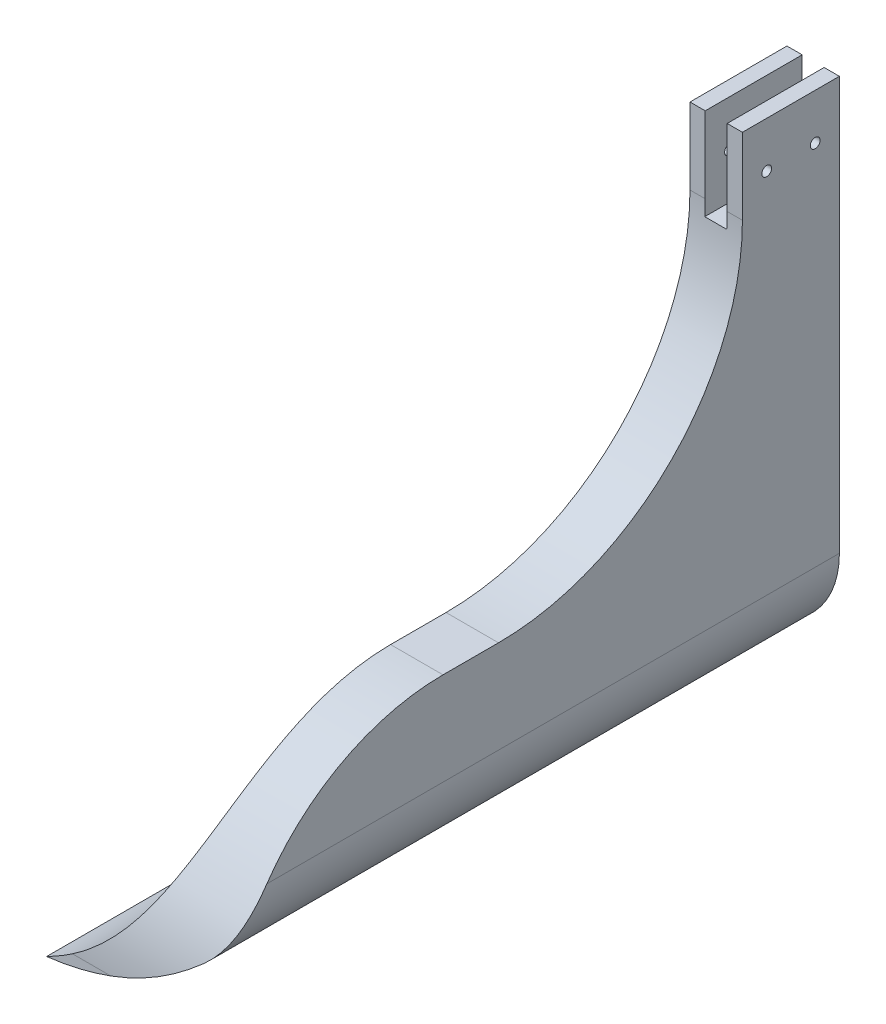
ISO-10303-21;
HEADER;
FILE_DESCRIPTION(('STEP AP214'),'2;1');
FILE_NAME('part.step','',(''),(''),'','','');
FILE_SCHEMA(('AUTOMOTIVE_DESIGN { 1 0 10303 214 1 1 1 1 }'));
ENDSEC;
DATA;
#1=APPLICATION_CONTEXT('core data for automotive mechanical design processes');
#2=APPLICATION_PROTOCOL_DEFINITION('international standard','automotive_design',2000,#1);
#3=PRODUCT_CONTEXT('',#1,'mechanical');
#4=PRODUCT('Part','Part','',(#3));
#5=PRODUCT_RELATED_PRODUCT_CATEGORY('part','',(#4));
#6=PRODUCT_DEFINITION_FORMATION('','',#4);
#7=PRODUCT_DEFINITION_CONTEXT('part definition',#1,'design');
#8=PRODUCT_DEFINITION('design','',#6,#7);
#9=PRODUCT_DEFINITION_SHAPE('','',#8);
#10=(LENGTH_UNIT() NAMED_UNIT(*) SI_UNIT(.MILLI.,.METRE.));
#11=(NAMED_UNIT(*) PLANE_ANGLE_UNIT() SI_UNIT($,.RADIAN.));
#12=(NAMED_UNIT(*) SI_UNIT($,.STERADIAN.) SOLID_ANGLE_UNIT());
#13=UNCERTAINTY_MEASURE_WITH_UNIT(LENGTH_MEASURE(1.E-05),#10,'distance_accuracy_value','');
#14=(GEOMETRIC_REPRESENTATION_CONTEXT(3) GLOBAL_UNCERTAINTY_ASSIGNED_CONTEXT((#13)) GLOBAL_UNIT_ASSIGNED_CONTEXT((#10,
#11,#12)) REPRESENTATION_CONTEXT('',''));
#15=CARTESIAN_POINT('',(0.,0.,0.));
#16=DIRECTION('',(0.,0.,1.));
#17=DIRECTION('',(1.,0.,0.));
#18=AXIS2_PLACEMENT_3D('',#15,#16,#17);
#19=CARTESIAN_POINT('',(0.,0.,31.8));
#20=DIRECTION('',(0.,0.,1.));
#21=DIRECTION('',(-1.,0.,0.));
#22=AXIS2_PLACEMENT_3D('',#19,#20,#21);
#23=PLANE('',#22);
#24=DIRECTION('',(0.,1.,0.));
#25=VECTOR('',#24,1.);
#26=CARTESIAN_POINT('',(30.,0.,31.8));
#27=LINE('',#26,#25);
#28=CARTESIAN_POINT('',(30.,80.,31.8));
#29=VERTEX_POINT('',#28);
#30=CARTESIAN_POINT('',(30.,105.,31.8));
#31=VERTEX_POINT('',#30);
#32=EDGE_CURVE('E238',#29,#31,#27,.T.);
#33=ORIENTED_EDGE('',*,*,#32,.T.);
#34=DIRECTION('',(-1.,0.,0.));
#35=VECTOR('',#34,1.);
#36=CARTESIAN_POINT('',(0.,105.,31.8));
#37=LINE('',#36,#35);
#38=CARTESIAN_POINT('',(25.,105.,31.8));
#39=VERTEX_POINT('',#38);
#40=EDGE_CURVE('E254',#31,#39,#37,.T.);
#41=ORIENTED_EDGE('',*,*,#40,.T.);
#42=DIRECTION('',(0.,-1.,0.));
#43=VECTOR('',#42,1.);
#44=CARTESIAN_POINT('',(25.,0.,31.8));
#45=LINE('',#44,#43);
#46=CARTESIAN_POINT('',(25.,80.,31.8));
#47=VERTEX_POINT('',#46);
#48=EDGE_CURVE('E251',#39,#47,#45,.T.);
#49=ORIENTED_EDGE('',*,*,#48,.T.);
#50=DIRECTION('',(-1.,0.,0.));
#51=VECTOR('',#50,1.);
#52=CARTESIAN_POINT('',(12.8,80.,31.8));
#53=LINE('',#52,#51);
#54=EDGE_CURVE('E303',#29,#47,#53,.T.);
#55=ORIENTED_EDGE('',*,*,#54,.F.);
#56=EDGE_LOOP('',(#33,#41,#49,#55));
#57=FACE_BOUND('',#56,.T.);
#58=ADVANCED_FACE('F45',(#57),#23,.T.);
#59=DIRECTION('',(0.,-1.,0.));
#60=VECTOR('',#59,1.);
#61=CARTESIAN_POINT('',(17.8,0.,31.8));
#62=LINE('',#61,#60);
#63=CARTESIAN_POINT('',(17.8,105.,31.8));
#64=VERTEX_POINT('',#63);
#65=CARTESIAN_POINT('',(17.8,80.,31.8));
#66=VERTEX_POINT('',#65);
#67=EDGE_CURVE('E248',#64,#66,#62,.T.);
#68=ORIENTED_EDGE('',*,*,#67,.F.);
#69=DIRECTION('',(-1.,0.,0.));
#70=VECTOR('',#69,1.);
#71=CARTESIAN_POINT('',(0.,105.,31.8));
#72=LINE('',#71,#70);
#73=CARTESIAN_POINT('',(12.8,105.,31.8));
#74=VERTEX_POINT('',#73);
#75=EDGE_CURVE('E245',#64,#74,#72,.T.);
#76=ORIENTED_EDGE('',*,*,#75,.T.);
#77=DIRECTION('',(0.,-1.,0.));
#78=VECTOR('',#77,1.);
#79=CARTESIAN_POINT('',(12.8,0.,31.8));
#80=LINE('',#79,#78);
#81=CARTESIAN_POINT('',(12.8,80.,31.8));
#82=VERTEX_POINT('',#81);
#83=EDGE_CURVE('E241',#74,#82,#80,.T.);
#84=ORIENTED_EDGE('',*,*,#83,.T.);
#85=DIRECTION('',(-1.,0.,0.));
#86=VECTOR('',#85,1.);
#87=CARTESIAN_POINT('',(12.8,80.,31.8));
#88=LINE('',#87,#86);
#89=EDGE_CURVE('E300',#66,#82,#88,.T.);
#90=ORIENTED_EDGE('',*,*,#89,.F.);
#91=EDGE_LOOP('',(#68,#76,#84,#90));
#92=FACE_BOUND('',#91,.T.);
#93=ADVANCED_FACE('F384',(#92),#23,.T.);
#94=CARTESIAN_POINT('',(30.,0.,31.8));
#95=DIRECTION('',(1.,0.,0.));
#96=DIRECTION('',(0.,-1.,0.));
#97=AXIS2_PLACEMENT_3D('',#94,#95,#96);
#98=PLANE('',#97);
#99=CARTESIAN_POINT('',(30.,90.,7.95));
#100=DIRECTION('',(1.,0.,0.));
#101=DIRECTION('',(0.,0.,1.));
#102=AXIS2_PLACEMENT_3D('',#99,#100,#101);
#103=CIRCLE('',#102,1.6);
#104=CARTESIAN_POINT('',(30.,90.,9.55));
#105=VERTEX_POINT('',#104);
#106=EDGE_CURVE('E202',#105,#105,#103,.T.);
#107=ORIENTED_EDGE('',*,*,#106,.F.);
#108=EDGE_LOOP('',(#107));
#109=FACE_BOUND('',#108,.T.);
#110=CARTESIAN_POINT('',(30.,90.,23.85));
#111=DIRECTION('',(1.,0.,0.));
#112=DIRECTION('',(0.,0.,-1.));
#113=AXIS2_PLACEMENT_3D('',#110,#111,#112);
#114=CIRCLE('',#113,1.6);
#115=CARTESIAN_POINT('',(30.,90.,22.25));
#116=VERTEX_POINT('',#115);
#117=EDGE_CURVE('E190',#116,#116,#114,.T.);
#118=ORIENTED_EDGE('',*,*,#117,.F.);
#119=EDGE_LOOP('',(#118));
#120=FACE_BOUND('',#119,.T.);
#121=DIRECTION('',(0.,0.,1.));
#122=VECTOR('',#121,1.);
#123=CARTESIAN_POINT('',(30.,-30.4818047918599,200.));
#124=LINE('',#123,#122);
#125=CARTESIAN_POINT('',(30.,-30.4818047918599,0.));
#126=VERTEX_POINT('',#125);
#127=CARTESIAN_POINT('',(30.,-30.4818047918599,187.778129491109));
#128=VERTEX_POINT('',#127);
#129=EDGE_CURVE('E324',#126,#128,#124,.T.);
#130=ORIENTED_EDGE('',*,*,#129,.F.);
#131=DIRECTION('',(0.,1.,0.));
#132=VECTOR('',#131,1.);
#133=CARTESIAN_POINT('',(30.,0.,0.));
#134=LINE('',#133,#132);
#135=CARTESIAN_POINT('',(30.,105.,0.));
#136=VERTEX_POINT('',#135);
#137=EDGE_CURVE('E235',#126,#136,#134,.T.);
#138=ORIENTED_EDGE('',*,*,#137,.T.);
#139=DIRECTION('',(0.,0.,-1.));
#140=VECTOR('',#139,1.);
#141=CARTESIAN_POINT('',(30.,105.,31.8));
#142=LINE('',#141,#140);
#143=EDGE_CURVE('E257',#31,#136,#142,.T.);
#144=ORIENTED_EDGE('',*,*,#143,.F.);
#145=ORIENTED_EDGE('',*,*,#32,.F.);
#146=CARTESIAN_POINT('',(30.,80.,111.8));
#147=DIRECTION('',(-1.,0.,0.));
#148=DIRECTION('',(0.,-1.,0.));
#149=AXIS2_PLACEMENT_3D('',#146,#147,#148);
#150=CIRCLE('',#149,80.);
#151=CARTESIAN_POINT('',(30.,0.,111.8));
#152=VERTEX_POINT('',#151);
#153=EDGE_CURVE('E317',#152,#29,#150,.F.);
#154=ORIENTED_EDGE('',*,*,#153,.F.);
#155=DIRECTION('',(0.,0.,-1.));
#156=VECTOR('',#155,1.);
#157=CARTESIAN_POINT('',(30.,0.,200.));
#158=LINE('',#157,#156);
#159=CARTESIAN_POINT('',(30.,0.,130.));
#160=VERTEX_POINT('',#159);
#161=EDGE_CURVE('E231',#160,#152,#158,.T.);
#162=ORIENTED_EDGE('',*,*,#161,.F.);
#163=CARTESIAN_POINT('',(30.0000000000001,-70.,130.));
#164=DIRECTION('',(-1.,0.,0.));
#165=DIRECTION('',(0.,-1.,0.));
#166=AXIS2_PLACEMENT_3D('',#163,#164,#165);
#167=CIRCLE('',#166,70.);
#168=EDGE_CURVE('E367',#128,#160,#167,.T.);
#169=ORIENTED_EDGE('',*,*,#168,.F.);
#170=EDGE_LOOP('',(#130,#138,#144,#145,#154,#162,#169));
#171=FACE_BOUND('',#170,.T.);
#172=ADVANCED_FACE('F351',(#109,#120,#171),#98,.T.);
#173=CARTESIAN_POINT('',(-40.5018522884248,16.2007409153699,31.8));
#174=DIRECTION('',(0.,0.,-1.));
#175=DIRECTION('',(1.,0.,0.));
#176=AXIS2_PLACEMENT_3D('',#173,#174,#175);
#177=CYLINDRICAL_SURFACE('',#176,91.803398874989);
#178=DIRECTION('',(0.,0.,-1.));
#179=VECTOR('',#178,1.);
#180=CARTESIAN_POINT('',(0.,-66.1853259054642,31.8));
#181=LINE('',#180,#179);
#182=CARTESIAN_POINT('',(0.,-66.1853259054642,160.893258265666));
#183=VERTEX_POINT('',#182);
#184=CARTESIAN_POINT('',(0.,-66.1853259054642,179.909808110345));
#185=VERTEX_POINT('',#184);
#186=EDGE_CURVE('E193',#183,#185,#181,.F.);
#187=ORIENTED_EDGE('',*,*,#186,.T.);
#188=CARTESIAN_POINT('',(-40.5018522884248,16.2007409153699,15.1376744686769));
#189=DIRECTION('',(0.,-0.894427190999916,-0.447213595499958));
#190=DIRECTION('',(0.,0.447213595499958,-0.894427190999916));
#191=AXIS2_PLACEMENT_3D('',#188,#189,#190);
#192=ELLIPSE('',#191,205.278640450003,91.803398874989);
#193=CARTESIAN_POINT('',(15.325484142754,-56.6770509831248,160.893258265666));
#194=VERTEX_POINT('',#193);
#195=EDGE_CURVE('E54',#194,#185,#192,.T.);
#196=ORIENTED_EDGE('',*,*,#195,.F.);
#197=CARTESIAN_POINT('',(-40.5018522884248,16.2007409153699,160.893258265666));
#198=DIRECTION('',(0.,0.,1.));
#199=DIRECTION('',(1.,0.,0.));
#200=AXIS2_PLACEMENT_3D('',#197,#198,#199);
#201=CIRCLE('',#200,91.803398874989);
#202=EDGE_CURVE('E11',#183,#194,#201,.T.);
#203=ORIENTED_EDGE('',*,*,#202,.F.);
#204=EDGE_LOOP('',(#187,#196,#203));
#205=FACE_BOUND('',#204,.T.);
#206=CARTESIAN_POINT('',(-40.5018522884248,16.2007409153699,21.8458784011762));
#207=DIRECTION('',(0.,0.894427190999916,0.447213595499958));
#208=DIRECTION('',(0.,0.447213595499958,-0.894427190999916));
#209=AXIS2_PLACEMENT_3D('',#206,#207,#208);
#210=ELLIPSE('',#209,205.278640450003,91.803398874989);
#211=CARTESIAN_POINT('',(0.,-66.1853259054642,186.618012042844));
#212=VERTEX_POINT('',#211);
#213=CARTESIAN_POINT('',(17.4491488944943,-55.,164.247360231916));
#214=VERTEX_POINT('',#213);
#215=EDGE_CURVE('E697',#212,#214,#210,.T.);
#216=ORIENTED_EDGE('',*,*,#215,.F.);
#217=DIRECTION('',(0.,0.,-1.));
#218=VECTOR('',#217,1.);
#219=CARTESIAN_POINT('',(0.,-66.1853259054642,31.8));
#220=LINE('',#219,#218);
#221=CARTESIAN_POINT('',(0.,-66.1853259054642,190.893258265666));
#222=VERTEX_POINT('',#221);
#223=EDGE_CURVE('E689',#222,#212,#220,.T.);
#224=ORIENTED_EDGE('',*,*,#223,.F.);
#225=CARTESIAN_POINT('',(-40.5018522884248,16.2007409153699,190.893258265666));
#226=DIRECTION('',(0.,0.,-1.));
#227=DIRECTION('',(-1.,0.,0.));
#228=AXIS2_PLACEMENT_3D('',#225,#226,#227);
#229=CIRCLE('',#228,91.803398874989);
#230=CARTESIAN_POINT('',(17.4491488944943,-55.,190.893258265666));
#231=VERTEX_POINT('',#230);
#232=EDGE_CURVE('E693',#231,#222,#229,.T.);
#233=ORIENTED_EDGE('',*,*,#232,.F.);
#234=DIRECTION('',(0.,0.,-1.));
#235=VECTOR('',#234,1.);
#236=CARTESIAN_POINT('',(17.4491488944943,-55.,31.8));
#237=LINE('',#236,#235);
#238=EDGE_CURVE('E703',#214,#231,#237,.F.);
#239=ORIENTED_EDGE('',*,*,#238,.F.);
#240=EDGE_LOOP('',(#216,#224,#233,#239));
#241=FACE_BOUND('',#240,.T.);
#242=CARTESIAN_POINT('',(-40.5018522884248,16.2007409153699,200.));
#243=DIRECTION('',(0.,0.,-1.));
#244=DIRECTION('',(-1.,0.,0.));
#245=AXIS2_PLACEMENT_3D('',#242,#243,#244);
#246=CIRCLE('',#245,91.803398874989);
#247=CARTESIAN_POINT('',(-8.92185370321916,-70.,200.));
#248=VERTEX_POINT('',#247);
#249=CARTESIAN_POINT('',(-30.,-75.,200.));
#250=VERTEX_POINT('',#249);
#251=EDGE_CURVE('E228',#248,#250,#246,.T.);
#252=ORIENTED_EDGE('',*,*,#251,.T.);
#253=DIRECTION('',(0.,0.,-1.));
#254=VECTOR('',#253,1.);
#255=CARTESIAN_POINT('',(-30.,-75.,31.8));
#256=LINE('',#255,#254);
#257=CARTESIAN_POINT('',(-30.,-75.,0.));
#258=VERTEX_POINT('',#257);
#259=EDGE_CURVE('E297',#250,#258,#256,.T.);
#260=ORIENTED_EDGE('',*,*,#259,.T.);
#261=CARTESIAN_POINT('',(-40.5018522884248,16.2007409153699,0.));
#262=DIRECTION('',(0.,0.,-1.));
#263=DIRECTION('',(-1.,0.,0.));
#264=AXIS2_PLACEMENT_3D('',#261,#262,#263);
#265=CIRCLE('',#264,91.803398874989);
#266=CARTESIAN_POINT('',(19.660012083,-53.1419884825606,0.));
#267=VERTEX_POINT('',#266);
#268=EDGE_CURVE('E260',#267,#258,#265,.T.);
#269=ORIENTED_EDGE('',*,*,#268,.F.);
#270=DIRECTION('',(0.,0.,-1.));
#271=VECTOR('',#270,1.);
#272=CARTESIAN_POINT('',(19.660012083,-53.1419884825606,31.8));
#273=LINE('',#272,#271);
#274=CARTESIAN_POINT('',(19.660012083,-53.1419884825606,197.939733938822));
#275=VERTEX_POINT('',#274);
#276=EDGE_CURVE('E319',#275,#267,#273,.T.);
#277=ORIENTED_EDGE('',*,*,#276,.F.);
#278=CARTESIAN_POINT('',(-8.92185370321916,-70.,200.));
#279=CARTESIAN_POINT('',(-8.26411347929146,-69.7590340717941,199.999996557121));
#280=CARTESIAN_POINT('',(-7.60915491631928,-69.5105483306834,199.998756105011));
#281=CARTESIAN_POINT('',(-6.3051005385999,-68.9986541052959,199.993306250773));
#282=CARTESIAN_POINT('',(-5.65600478485099,-68.7352454659641,199.989096817792));
#283=CARTESIAN_POINT('',(-3.71796967445498,-67.9228133991998,199.971272558723));
#284=CARTESIAN_POINT('',(-2.43829432753717,-67.3515881678083,199.952461754739));
#285=CARTESIAN_POINT('',(0.0808646972158559,-66.1572063567584,199.896972592429));
#286=CARTESIAN_POINT('',(1.32061868494865,-65.5346107836442,199.860470339025));
#287=CARTESIAN_POINT('',(3.77000210090307,-64.2342601642477,199.765186323071));
#288=CARTESIAN_POINT('',(4.9796318632748,-63.556505730166,199.70640480777));
#289=CARTESIAN_POINT('',(7.36616863705288,-62.1474395501762,199.561763915276));
#290=CARTESIAN_POINT('',(8.54306534212335,-61.416111193555,199.475896112403));
#291=CARTESIAN_POINT('',(10.8605794110915,-59.9023483642921,199.272077014389));
#292=CARTESIAN_POINT('',(12.0011988308855,-59.1199167954588,199.154127541001));
#293=CARTESIAN_POINT('',(14.2540933252477,-57.4986133623688,198.87958909915));
#294=CARTESIAN_POINT('',(15.3659815239629,-56.6592638878951,198.722633109577));
#295=CARTESIAN_POINT('',(17.0011786800007,-55.3656549531663,198.454582993224));
#296=CARTESIAN_POINT('',(17.5408960161882,-54.9286090246824,198.35977765231));
#297=CARTESIAN_POINT('',(18.6090291205779,-54.0434682881892,198.158602112912));
#298=CARTESIAN_POINT('',(19.1374444600317,-53.5953730624011,198.05223147662));
#299=CARTESIAN_POINT('',(19.6600120829999,-53.1419884825606,197.939733938822));
#300=B_SPLINE_CURVE_WITH_KNOTS('',3,(#278,#279,#280,#281,#282,#283,#284,#285,#286,#287,#288,
#289,#290,#291,#292,#293,#294,#295,#296,#297,#298,#299),.UNSPECIFIED.,.F.,.F.,(4,2,2,2,2,2,2,2,
2,2,4),(0.,2.10137287499703,4.20276758812977,8.40559486633036,12.5674196708921,16.7291982902267,
20.8922727846682,25.0551109285769,29.2587084386886,31.3612368974471,33.463844975971),.UNSPECIFIED.);
#301=EDGE_CURVE('E354',#248,#275,#300,.T.);
#302=ORIENTED_EDGE('',*,*,#301,.F.);
#303=EDGE_LOOP('',(#252,#260,#269,#277,#302));
#304=FACE_BOUND('',#303,.T.);
#305=ADVANCED_FACE('F345',(#205,#241,#304),#177,.T.);
#306=CARTESIAN_POINT('',(-65.6980576649736,-4.91604175918838,31.8));
#307=DIRECTION('',(0.,0.,-1.));
#308=DIRECTION('',(1.,0.,0.));
#309=AXIS2_PLACEMENT_3D('',#306,#307,#308);
#310=CYLINDRICAL_SURFACE('',#309,78.6518437403193);
#311=DIRECTION('',(0.,0.,-1.));
#312=VECTOR('',#311,1.);
#313=CARTESIAN_POINT('',(12.8,0.,200.));
#314=LINE('',#313,#312);
#315=CARTESIAN_POINT('',(12.8,0.,130.));
#316=VERTEX_POINT('',#315);
#317=CARTESIAN_POINT('',(12.8,0.,111.8));
#318=VERTEX_POINT('',#317);
#319=EDGE_CURVE('E232',#316,#318,#314,.T.);
#320=ORIENTED_EDGE('',*,*,#319,.T.);
#321=DIRECTION('',(0.,0.,-1.));
#322=VECTOR('',#321,1.);
#323=CARTESIAN_POINT('',(12.8,0.,31.8));
#324=LINE('',#323,#322);
#325=CARTESIAN_POINT('',(12.8,0.,0.));
#326=VERTEX_POINT('',#325);
#327=EDGE_CURVE('E294',#318,#326,#324,.T.);
#328=ORIENTED_EDGE('',*,*,#327,.T.);
#329=CARTESIAN_POINT('',(-65.6980576649736,-4.91604175918838,0.));
#330=DIRECTION('',(0.,0.,-1.));
#331=DIRECTION('',(-1.,0.,0.));
#332=AXIS2_PLACEMENT_3D('',#329,#330,#331);
#333=CIRCLE('',#332,78.6518437403193);
#334=EDGE_CURVE('E263',#326,#258,#333,.T.);
#335=ORIENTED_EDGE('',*,*,#334,.T.);
#336=ORIENTED_EDGE('',*,*,#259,.F.);
#337=CARTESIAN_POINT('',(-65.6980576649736,-4.91604175918838,200.));
#338=DIRECTION('',(0.,0.,-1.));
#339=DIRECTION('',(-1.,0.,0.));
#340=AXIS2_PLACEMENT_3D('',#337,#338,#339);
#341=CIRCLE('',#340,78.6518437403193);
#342=CARTESIAN_POINT('',(-21.5370918302017,-70.,200.));
#343=VERTEX_POINT('',#342);
#344=EDGE_CURVE('E226',#343,#250,#341,.T.);
#345=ORIENTED_EDGE('',*,*,#344,.F.);
#346=CARTESIAN_POINT('',(12.8,0.,130.));
#347=CARTESIAN_POINT('',(12.7999642052155,1.32345455669019E-05,130.98094729135));
#348=CARTESIAN_POINT('',(12.8012901008779,-0.0206193070886854,131.961892960559));
#349=CARTESIAN_POINT('',(12.8064078399143,-0.10308054150943,133.922039054772));
#350=CARTESIAN_POINT('',(12.8101996682476,-0.164908983029099,134.901239490383));
#351=CARTESIAN_POINT('',(12.8199915316035,-0.329661340319642,136.856102501738));
#352=CARTESIAN_POINT('',(12.8259914251348,-0.432582622927384,137.831765300127));
#353=CARTESIAN_POINT('',(12.8396924430125,-0.679333026045934,139.777891860139));
#354=CARTESIAN_POINT('',(12.8473935675724,-0.823162151692727,140.74835562111));
#355=CARTESIAN_POINT('',(12.8638184684743,-1.15158193864885,142.683006513837));
#356=CARTESIAN_POINT('',(12.8725429113507,-1.33619923711572,143.647189118037));
#357=CARTESIAN_POINT('',(12.8901362015666,-1.74581581673852,145.566940995437));
#358=CARTESIAN_POINT('',(12.8990050495374,-1.97081527447156,146.522510230956));
#359=CARTESIAN_POINT('',(12.9158367242898,-2.46079960482181,148.423347259794));
#360=CARTESIAN_POINT('',(12.9237995534837,-2.72578437097588,149.368615080534));
#361=CARTESIAN_POINT('',(12.9376006330794,-3.29527453695544,151.247186571631));
#362=CARTESIAN_POINT('',(12.9434388834784,-3.59977993683442,152.18049024197));
#363=CARTESIAN_POINT('',(12.9516171100602,-4.24798538026195,154.034083960523));
#364=CARTESIAN_POINT('',(12.9539548115935,-4.59171075291293,154.954365162439));
#365=CARTESIAN_POINT('',(12.953598374494,-5.31761526962595,156.779729437704));
#366=CARTESIAN_POINT('',(12.9509037973953,-5.69979776173786,157.684811179779));
#367=CARTESIAN_POINT('',(12.9388198943983,-6.50187184626557,159.477997962379));
#368=CARTESIAN_POINT('',(12.9294309972237,-6.92176102233105,160.366104086332));
#369=CARTESIAN_POINT('',(12.9021725554772,-7.79852359327602,162.123838410132));
#370=CARTESIAN_POINT('',(12.884302272619,-8.25540020495931,162.993464994487));
#371=CARTESIAN_POINT('',(12.8381948363613,-9.20503309027219,164.712181682612));
#372=CARTESIAN_POINT('',(12.8099617614731,-9.69777518714552,165.561279725911));
#373=CARTESIAN_POINT('',(12.7411414527228,-10.7182908646927,167.237640193839));
#374=CARTESIAN_POINT('',(12.7005543474723,-11.2460640806306,168.064902845689));
#375=CARTESIAN_POINT('',(12.6049609531509,-12.3355304447598,169.695979780155));
#376=CARTESIAN_POINT('',(12.5499541463491,-12.8972248103128,170.499793219688));
#377=CARTESIAN_POINT('',(12.4234087432706,-14.0531640085298,172.082198835525));
#378=CARTESIAN_POINT('',(12.3518720097676,-14.6474051677109,172.860793842453));
#379=CARTESIAN_POINT('',(12.1920437722545,-15.8524554175663,174.372915322861));
#380=CARTESIAN_POINT('',(12.1041934550096,-16.4625293539679,175.107074148351));
#381=CARTESIAN_POINT('',(11.9086905829031,-17.710733480593,176.548267763277));
#382=CARTESIAN_POINT('',(11.8010404654614,-18.348860210076,177.255305878427));
#383=CARTESIAN_POINT('',(11.5639356571324,-19.6515506920616,178.64090793562));
#384=CARTESIAN_POINT('',(11.4344793993949,-20.3161163416736,179.319469827164));
#385=CARTESIAN_POINT('',(11.1518321938311,-21.6696962583781,180.646619764897));
#386=CARTESIAN_POINT('',(10.9986412898397,-22.3587104803153,181.295207866442));
#387=CARTESIAN_POINT('',(10.6668499143928,-23.7582831361081,182.560370286155));
#388=CARTESIAN_POINT('',(10.4882765034753,-24.4688179997998,183.176977755734));
#389=CARTESIAN_POINT('',(10.1038723756982,-25.9097528843875,184.377656933986));
#390=CARTESIAN_POINT('',(9.89804147436741,-26.6401530396997,184.961728422429));
#391=CARTESIAN_POINT('',(9.45758268403362,-28.1181270265323,186.096135696885));
#392=CARTESIAN_POINT('',(9.22295823794597,-28.8656987961282,186.646475504503));
#393=CARTESIAN_POINT('',(8.72351918589893,-30.3752916580421,187.712531037096));
#394=CARTESIAN_POINT('',(8.4587055543141,-31.137312283353,188.228247878695));
#395=CARTESIAN_POINT('',(7.93001931109923,-32.584472773664,189.167003233628));
#396=CARTESIAN_POINT('',(7.669544319307,-33.268370169632,189.593877807661));
#397=CARTESIAN_POINT('',(7.12341517144908,-34.6430082659281,190.41958244135));
#398=CARTESIAN_POINT('',(6.83776131712554,-35.3337488841593,190.818412836983));
#399=CARTESIAN_POINT('',(6.24082257612842,-36.7198050399644,191.587798058142));
#400=CARTESIAN_POINT('',(5.92953968663455,-37.4151202171811,191.958355082584));
#401=CARTESIAN_POINT('',(5.28101495200494,-38.8081357225157,192.671203678839));
#402=CARTESIAN_POINT('',(4.94377295444956,-39.5058360646151,193.013495084667));
#403=CARTESIAN_POINT('',(4.24327025766634,-40.9012120614288,193.669890120222));
#404=CARTESIAN_POINT('',(3.88001513011249,-41.5988876895975,193.98399975384));
#405=CARTESIAN_POINT('',(3.12745058026877,-42.9921340918443,194.584445569177));
#406=CARTESIAN_POINT('',(2.73814107478683,-43.6877048591942,194.870781662207));
#407=CARTESIAN_POINT('',(1.93366641804871,-45.0745406619204,195.416180525879));
#408=CARTESIAN_POINT('',(1.51850190119297,-45.7658058024858,195.675243965286));
#409=CARTESIAN_POINT('',(0.662642720439212,-47.141940330372,196.166781298714));
#410=CARTESIAN_POINT('',(0.221948330836136,-47.8268097863169,196.399255478333));
#411=CARTESIAN_POINT('',(-0.656477467979024,-49.1460540171751,196.824869596594));
#412=CARTESIAN_POINT('',(-1.09270702314447,-49.7809324562113,197.01955289668));
#413=CARTESIAN_POINT('',(-1.9867943613766,-51.0417916830196,197.38707289288));
#414=CARTESIAN_POINT('',(-2.44465384188241,-51.6677717674492,197.55990787049));
#415=CARTESIAN_POINT('',(-3.38139036084645,-52.9092711531631,197.884597783291));
#416=CARTESIAN_POINT('',(-3.86026549470647,-53.5247913954127,198.036454614529));
#417=CARTESIAN_POINT('',(-4.8384733175493,-54.7440936289768,198.320196643952));
#418=CARTESIAN_POINT('',(-5.33780769178084,-55.3478746472546,198.452080192699));
#419=CARTESIAN_POINT('',(-6.86598372777234,-57.1402132667528,198.819425881448));
#420=CARTESIAN_POINT('',(-7.92470865160013,-58.3093819594017,199.026484181363));
#421=CARTESIAN_POINT('',(-10.1156727859152,-60.5865713259255,199.373729735374));
#422=CARTESIAN_POINT('',(-11.2479006604402,-61.6946013803495,199.51392727334));
#423=CARTESIAN_POINT('',(-13.1281865319347,-63.4264237151067,199.693798922025));
#424=CARTESIAN_POINT('',(-13.855125488556,-64.0715004017586,199.751374756066));
#425=CARTESIAN_POINT('',(-15.3330564455398,-65.334779522204,199.847239474091));
#426=CARTESIAN_POINT('',(-16.0840445250149,-65.952986298424,199.885531485188));
#427=CARTESIAN_POINT('',(-17.6063569047051,-67.159442679523,199.944942190882));
#428=CARTESIAN_POINT('',(-18.377607137825,-67.7477831586652,199.966116322529));
#429=CARTESIAN_POINT('',(-19.9415770152844,-68.8957153735764,199.993641814773));
#430=CARTESIAN_POINT('',(-20.7342984535689,-69.4553046957657,199.999991932918));
#431=CARTESIAN_POINT('',(-21.5370918302017,-70.,200.));
#432=B_SPLINE_CURVE_WITH_KNOTS('',3,(#346,#347,#348,#349,#350,#351,#352,#353,#354,#355,#356,
#357,#358,#359,#360,#361,#362,#363,#364,#365,#366,#367,#368,#369,#370,#371,#372,#373,#374,#375,
#376,#377,#378,#379,#380,#381,#382,#383,#384,#385,#386,#387,#388,#389,#390,#391,#392,#393,#394,
#395,#396,#397,#398,#399,#400,#401,#402,#403,#404,#405,#406,#407,#408,#409,#410,#411,#412,#413,
#414,#415,#416,#417,#418,#419,#420,#421,#422,#423,#424,#425,#426,#427,#428,#429,#430,#431),
.UNSPECIFIED.,.F.,.F.,(4,2,2,2,2,2,2,2,2,2,2,2,2,2,2,2,2,2,2,2,2,2,2,2,2,2,2,2,2,2,2,2,2,2,2,2,
2,2,2,2,2,2,4),(0.,2.94262158965359,5.88522523149164,8.82764034627742,11.7700558304839,
14.7143986010373,17.6587542464902,20.6031020525685,23.5474498626326,26.4937100749431,
29.4402270088876,32.3865552563032,35.3331400222494,38.2785663343969,41.2239619842527,
44.1694634013128,47.1146330486765,49.9894298934195,52.8638730778792,55.7385228896609,
58.6131673923732,61.4847698800872,64.3563918029919,67.2276706929036,70.0988569367424,
72.6396807618396,75.1804741419777,77.7210697141669,80.2616802046734,82.8017481477324,
85.3418242016574,87.881837954664,90.4218244226245,92.8047485940591,95.1878600805122,
97.5707560355112,99.9538486682678,104.721504243682,109.488426268181,112.408419445765,
115.327938957314,118.23796516056,121.148235254614),.UNSPECIFIED.);
#433=EDGE_CURVE('E329',#316,#343,#432,.T.);
#434=ORIENTED_EDGE('',*,*,#433,.F.);
#435=EDGE_LOOP('',(#320,#328,#335,#336,#345,#434));
#436=FACE_BOUND('',#435,.T.);
#437=ADVANCED_FACE('F339',(#436),#310,.F.);
#438=CARTESIAN_POINT('',(12.8,0.,31.8));
#439=DIRECTION('',(-1.,0.,0.));
#440=DIRECTION('',(0.,1.,0.));
#441=AXIS2_PLACEMENT_3D('',#438,#439,#440);
#442=PLANE('',#441);
#443=CARTESIAN_POINT('',(12.8,90.,7.95));
#444=DIRECTION('',(1.,0.,0.));
#445=DIRECTION('',(0.,1.,0.));
#446=AXIS2_PLACEMENT_3D('',#443,#444,#445);
#447=CIRCLE('',#446,1.6);
#448=CARTESIAN_POINT('',(12.8,91.6,7.95));
#449=VERTEX_POINT('',#448);
#450=EDGE_CURVE('E223',#449,#449,#447,.T.);
#451=ORIENTED_EDGE('',*,*,#450,.T.);
#452=EDGE_LOOP('',(#451));
#453=FACE_BOUND('',#452,.T.);
#454=CARTESIAN_POINT('',(12.8,90.,23.85));
#455=DIRECTION('',(1.,0.,0.));
#456=DIRECTION('',(0.,1.,0.));
#457=AXIS2_PLACEMENT_3D('',#454,#455,#456);
#458=CIRCLE('',#457,1.6);
#459=CARTESIAN_POINT('',(12.8,91.6,23.85));
#460=VERTEX_POINT('',#459);
#461=EDGE_CURVE('E216',#460,#460,#458,.T.);
#462=ORIENTED_EDGE('',*,*,#461,.T.);
#463=EDGE_LOOP('',(#462));
#464=FACE_BOUND('',#463,.T.);
#465=DIRECTION('',(0.,-1.,0.));
#466=VECTOR('',#465,1.);
#467=CARTESIAN_POINT('',(12.8,0.,0.));
#468=LINE('',#467,#466);
#469=CARTESIAN_POINT('',(12.8,105.,0.));
#470=VERTEX_POINT('',#469);
#471=EDGE_CURVE('E265',#470,#326,#468,.T.);
#472=ORIENTED_EDGE('',*,*,#471,.T.);
#473=ORIENTED_EDGE('',*,*,#327,.F.);
#474=CARTESIAN_POINT('',(12.8,80.,111.8));
#475=DIRECTION('',(1.,0.,0.));
#476=DIRECTION('',(0.,1.,0.));
#477=AXIS2_PLACEMENT_3D('',#474,#475,#476);
#478=CIRCLE('',#477,80.);
#479=EDGE_CURVE('E314',#82,#318,#478,.F.);
#480=ORIENTED_EDGE('',*,*,#479,.F.);
#481=ORIENTED_EDGE('',*,*,#83,.F.);
#482=DIRECTION('',(0.,0.,-1.));
#483=VECTOR('',#482,1.);
#484=CARTESIAN_POINT('',(12.8,105.,31.8));
#485=LINE('',#484,#483);
#486=EDGE_CURVE('E291',#74,#470,#485,.T.);
#487=ORIENTED_EDGE('',*,*,#486,.T.);
#488=EDGE_LOOP('',(#472,#473,#480,#481,#487));
#489=FACE_BOUND('',#488,.T.);
#490=ADVANCED_FACE('F344',(#453,#464,#489),#442,.T.);
#491=CARTESIAN_POINT('',(0.,105.,31.8));
#492=DIRECTION('',(0.,1.,0.));
#493=DIRECTION('',(0.,0.,1.));
#494=AXIS2_PLACEMENT_3D('',#491,#492,#493);
#495=PLANE('',#494);
#496=DIRECTION('',(-1.,0.,0.));
#497=VECTOR('',#496,1.);
#498=CARTESIAN_POINT('',(0.,105.,0.));
#499=LINE('',#498,#497);
#500=CARTESIAN_POINT('',(17.8,105.,0.));
#501=VERTEX_POINT('',#500);
#502=EDGE_CURVE('E267',#501,#470,#499,.T.);
#503=ORIENTED_EDGE('',*,*,#502,.T.);
#504=ORIENTED_EDGE('',*,*,#486,.F.);
#505=ORIENTED_EDGE('',*,*,#75,.F.);
#506=DIRECTION('',(0.,0.,-1.));
#507=VECTOR('',#506,1.);
#508=CARTESIAN_POINT('',(17.8,105.,31.8));
#509=LINE('',#508,#507);
#510=EDGE_CURVE('E288',#64,#501,#509,.T.);
#511=ORIENTED_EDGE('',*,*,#510,.T.);
#512=EDGE_LOOP('',(#503,#504,#505,#511));
#513=FACE_BOUND('',#512,.T.);
#514=ADVANCED_FACE('F411',(#513),#495,.T.);
#515=CARTESIAN_POINT('',(17.8,0.,31.8));
#516=DIRECTION('',(-1.,0.,0.));
#517=DIRECTION('',(0.,1.,0.));
#518=AXIS2_PLACEMENT_3D('',#515,#516,#517);
#519=PLANE('',#518);
#520=CARTESIAN_POINT('',(17.8,90.,7.95));
#521=DIRECTION('',(1.,0.,0.));
#522=DIRECTION('',(0.,1.,0.));
#523=AXIS2_PLACEMENT_3D('',#520,#521,#522);
#524=CIRCLE('',#523,1.6);
#525=CARTESIAN_POINT('',(17.8,91.6,7.95));
#526=VERTEX_POINT('',#525);
#527=EDGE_CURVE('E220',#526,#526,#524,.T.);
#528=ORIENTED_EDGE('',*,*,#527,.F.);
#529=EDGE_LOOP('',(#528));
#530=FACE_BOUND('',#529,.T.);
#531=CARTESIAN_POINT('',(17.8,90.,23.85));
#532=DIRECTION('',(1.,0.,0.));
#533=DIRECTION('',(0.,1.,0.));
#534=AXIS2_PLACEMENT_3D('',#531,#532,#533);
#535=CIRCLE('',#534,1.6);
#536=CARTESIAN_POINT('',(17.8,91.6,23.85));
#537=VERTEX_POINT('',#536);
#538=EDGE_CURVE('E213',#537,#537,#535,.T.);
#539=ORIENTED_EDGE('',*,*,#538,.F.);
#540=EDGE_LOOP('',(#539));
#541=FACE_BOUND('',#540,.T.);
#542=DIRECTION('',(0.,-1.,0.));
#543=VECTOR('',#542,1.);
#544=CARTESIAN_POINT('',(17.8,0.,0.));
#545=LINE('',#544,#543);
#546=CARTESIAN_POINT('',(17.8,75.,0.));
#547=VERTEX_POINT('',#546);
#548=EDGE_CURVE('E269',#501,#547,#545,.T.);
#549=ORIENTED_EDGE('',*,*,#548,.F.);
#550=ORIENTED_EDGE('',*,*,#510,.F.);
#551=ORIENTED_EDGE('',*,*,#67,.T.);
#552=CARTESIAN_POINT('',(17.8,80.,111.8));
#553=DIRECTION('',(1.,0.,0.));
#554=DIRECTION('',(0.,1.,0.));
#555=AXIS2_PLACEMENT_3D('',#552,#553,#554);
#556=CIRCLE('',#555,80.);
#557=CARTESIAN_POINT('',(17.8,75.,31.9564028866435));
#558=VERTEX_POINT('',#557);
#559=EDGE_CURVE('E312',#558,#66,#556,.T.);
#560=ORIENTED_EDGE('',*,*,#559,.F.);
#561=DIRECTION('',(0.,0.,-1.));
#562=VECTOR('',#561,1.);
#563=CARTESIAN_POINT('',(17.8,75.,31.8));
#564=LINE('',#563,#562);
#565=EDGE_CURVE('E285',#558,#547,#564,.T.);
#566=ORIENTED_EDGE('',*,*,#565,.T.);
#567=EDGE_LOOP('',(#549,#550,#551,#560,#566));
#568=FACE_BOUND('',#567,.T.);
#569=ADVANCED_FACE('F408',(#530,#541,#568),#519,.F.);
#570=CARTESIAN_POINT('',(0.,75.,31.8));
#571=DIRECTION('',(0.,1.,0.));
#572=DIRECTION('',(0.,0.,1.));
#573=AXIS2_PLACEMENT_3D('',#570,#571,#572);
#574=PLANE('',#573);
#575=DIRECTION('',(-1.,0.,0.));
#576=VECTOR('',#575,1.);
#577=CARTESIAN_POINT('',(0.,75.,0.));
#578=LINE('',#577,#576);
#579=CARTESIAN_POINT('',(25.,75.,0.));
#580=VERTEX_POINT('',#579);
#581=EDGE_CURVE('E272',#580,#547,#578,.T.);
#582=ORIENTED_EDGE('',*,*,#581,.T.);
#583=ORIENTED_EDGE('',*,*,#565,.F.);
#584=DIRECTION('',(1.,0.,0.));
#585=VECTOR('',#584,1.);
#586=CARTESIAN_POINT('',(25.,75.,31.9564028866435));
#587=LINE('',#586,#585);
#588=CARTESIAN_POINT('',(25.,75.,31.9564028866435));
#589=VERTEX_POINT('',#588);
#590=EDGE_CURVE('E310',#589,#558,#587,.F.);
#591=ORIENTED_EDGE('',*,*,#590,.F.);
#592=DIRECTION('',(0.,0.,-1.));
#593=VECTOR('',#592,1.);
#594=CARTESIAN_POINT('',(25.,75.,31.8));
#595=LINE('',#594,#593);
#596=EDGE_CURVE('E282',#589,#580,#595,.T.);
#597=ORIENTED_EDGE('',*,*,#596,.T.);
#598=EDGE_LOOP('',(#582,#583,#591,#597));
#599=FACE_BOUND('',#598,.T.);
#600=ADVANCED_FACE('F404',(#599),#574,.T.);
#601=CARTESIAN_POINT('',(25.,0.,31.8));
#602=DIRECTION('',(-1.,0.,0.));
#603=DIRECTION('',(0.,0.,-1.));
#604=AXIS2_PLACEMENT_3D('',#601,#602,#603);
#605=PLANE('',#604);
#606=CARTESIAN_POINT('',(25.,90.,7.95));
#607=DIRECTION('',(1.,0.,0.));
#608=DIRECTION('',(0.,0.,-1.));
#609=AXIS2_PLACEMENT_3D('',#606,#607,#608);
#610=CIRCLE('',#609,1.6);
#611=CARTESIAN_POINT('',(25.,90.,6.35));
#612=VERTEX_POINT('',#611);
#613=EDGE_CURVE('E219',#612,#612,#610,.T.);
#614=ORIENTED_EDGE('',*,*,#613,.T.);
#615=EDGE_LOOP('',(#614));
#616=FACE_BOUND('',#615,.T.);
#617=CARTESIAN_POINT('',(25.,90.,23.85));
#618=DIRECTION('',(1.,0.,0.));
#619=DIRECTION('',(0.,0.,-1.));
#620=AXIS2_PLACEMENT_3D('',#617,#618,#619);
#621=CIRCLE('',#620,1.6);
#622=CARTESIAN_POINT('',(25.,90.,22.25));
#623=VERTEX_POINT('',#622);
#624=EDGE_CURVE('E210',#623,#623,#621,.T.);
#625=ORIENTED_EDGE('',*,*,#624,.T.);
#626=EDGE_LOOP('',(#625));
#627=FACE_BOUND('',#626,.T.);
#628=DIRECTION('',(0.,-1.,0.));
#629=VECTOR('',#628,1.);
#630=CARTESIAN_POINT('',(25.,0.,0.));
#631=LINE('',#630,#629);
#632=CARTESIAN_POINT('',(25.,105.,0.));
#633=VERTEX_POINT('',#632);
#634=EDGE_CURVE('E274',#633,#580,#631,.T.);
#635=ORIENTED_EDGE('',*,*,#634,.T.);
#636=ORIENTED_EDGE('',*,*,#596,.F.);
#637=CARTESIAN_POINT('',(25.,80.,111.8));
#638=DIRECTION('',(1.,0.,0.));
#639=DIRECTION('',(0.,0.,-1.));
#640=AXIS2_PLACEMENT_3D('',#637,#638,#639);
#641=CIRCLE('',#640,80.);
#642=EDGE_CURVE('E308',#47,#589,#641,.F.);
#643=ORIENTED_EDGE('',*,*,#642,.F.);
#644=ORIENTED_EDGE('',*,*,#48,.F.);
#645=DIRECTION('',(0.,0.,-1.));
#646=VECTOR('',#645,1.);
#647=CARTESIAN_POINT('',(25.,105.,31.8));
#648=LINE('',#647,#646);
#649=EDGE_CURVE('E279',#39,#633,#648,.T.);
#650=ORIENTED_EDGE('',*,*,#649,.T.);
#651=EDGE_LOOP('',(#635,#636,#643,#644,#650));
#652=FACE_BOUND('',#651,.T.);
#653=ADVANCED_FACE('F400',(#616,#627,#652),#605,.T.);
#654=CARTESIAN_POINT('',(0.,105.,31.8));
#655=DIRECTION('',(0.,1.,0.));
#656=DIRECTION('',(0.,0.,1.));
#657=AXIS2_PLACEMENT_3D('',#654,#655,#656);
#658=PLANE('',#657);
#659=DIRECTION('',(-1.,0.,0.));
#660=VECTOR('',#659,1.);
#661=CARTESIAN_POINT('',(0.,105.,0.));
#662=LINE('',#661,#660);
#663=EDGE_CURVE('E242',#136,#633,#662,.T.);
#664=ORIENTED_EDGE('',*,*,#663,.T.);
#665=ORIENTED_EDGE('',*,*,#649,.F.);
#666=ORIENTED_EDGE('',*,*,#40,.F.);
#667=ORIENTED_EDGE('',*,*,#143,.T.);
#668=EDGE_LOOP('',(#664,#665,#666,#667));
#669=FACE_BOUND('',#668,.T.);
#670=ADVANCED_FACE('F396',(#669),#658,.T.);
#671=CARTESIAN_POINT('',(0.,0.,0.));
#672=DIRECTION('',(0.,0.,1.));
#673=DIRECTION('',(-1.,0.,0.));
#674=AXIS2_PLACEMENT_3D('',#671,#672,#673);
#675=PLANE('',#674);
#676=ORIENTED_EDGE('',*,*,#268,.T.);
#677=ORIENTED_EDGE('',*,*,#334,.F.);
#678=ORIENTED_EDGE('',*,*,#471,.F.);
#679=ORIENTED_EDGE('',*,*,#502,.F.);
#680=ORIENTED_EDGE('',*,*,#548,.T.);
#681=ORIENTED_EDGE('',*,*,#581,.F.);
#682=ORIENTED_EDGE('',*,*,#634,.F.);
#683=ORIENTED_EDGE('',*,*,#663,.F.);
#684=ORIENTED_EDGE('',*,*,#137,.F.);
#685=CARTESIAN_POINT('',(0.,-30.4818047918599,0.));
#686=DIRECTION('',(0.,0.,-1.));
#687=DIRECTION('',(-1.,0.,0.));
#688=AXIS2_PLACEMENT_3D('',#685,#686,#687);
#689=CIRCLE('',#688,30.);
#690=EDGE_CURVE('E322',#267,#126,#689,.F.);
#691=ORIENTED_EDGE('',*,*,#690,.F.);
#692=EDGE_LOOP('',(#676,#677,#678,#679,#680,#681,#682,#683,#684,#691));
#693=FACE_BOUND('',#692,.T.);
#694=ADVANCED_FACE('F393',(#693),#675,.F.);
#695=CARTESIAN_POINT('',(0.,0.,200.));
#696=DIRECTION('',(0.,1.,0.));
#697=DIRECTION('',(1.,0.,0.));
#698=AXIS2_PLACEMENT_3D('',#695,#696,#697);
#699=PLANE('',#698);
#700=ORIENTED_EDGE('',*,*,#161,.T.);
#701=DIRECTION('',(-1.,0.,0.));
#702=VECTOR('',#701,1.);
#703=CARTESIAN_POINT('',(30.,0.,111.8));
#704=LINE('',#703,#702);
#705=EDGE_CURVE('E306',#318,#152,#704,.F.);
#706=ORIENTED_EDGE('',*,*,#705,.F.);
#707=ORIENTED_EDGE('',*,*,#319,.F.);
#708=DIRECTION('',(-1.,0.,0.));
#709=VECTOR('',#708,1.);
#710=CARTESIAN_POINT('',(0.,0.,130.));
#711=LINE('',#710,#709);
#712=EDGE_CURVE('E327',#160,#316,#711,.T.);
#713=ORIENTED_EDGE('',*,*,#712,.F.);
#714=EDGE_LOOP('',(#700,#706,#707,#713));
#715=FACE_BOUND('',#714,.T.);
#716=ADVANCED_FACE('F380',(#715),#699,.T.);
#717=CARTESIAN_POINT('',(-65.6980576649736,-4.91604175918838,200.));
#718=DIRECTION('',(0.,0.,1.));
#719=DIRECTION('',(-1.,0.,0.));
#720=AXIS2_PLACEMENT_3D('',#717,#718,#719);
#721=PLANE('',#720);
#722=ORIENTED_EDGE('',*,*,#344,.T.);
#723=ORIENTED_EDGE('',*,*,#251,.F.);
#724=DIRECTION('',(-1.,0.,0.));
#725=VECTOR('',#724,1.);
#726=CARTESIAN_POINT('',(-65.6980576649735,-70.,200.));
#727=LINE('',#726,#725);
#728=EDGE_CURVE('E337',#343,#248,#727,.F.);
#729=ORIENTED_EDGE('',*,*,#728,.F.);
#730=EDGE_LOOP('',(#722,#723,#729));
#731=FACE_BOUND('',#730,.T.);
#732=ADVANCED_FACE('F375',(#731),#721,.T.);
#733=CARTESIAN_POINT('',(0.,80.,111.8));
#734=DIRECTION('',(1.,0.,0.));
#735=DIRECTION('',(0.,-1.,0.));
#736=AXIS2_PLACEMENT_3D('',#733,#734,#735);
#737=CYLINDRICAL_SURFACE('',#736,80.);
#738=ORIENTED_EDGE('',*,*,#153,.T.);
#739=ORIENTED_EDGE('',*,*,#54,.T.);
#740=ORIENTED_EDGE('',*,*,#642,.T.);
#741=ORIENTED_EDGE('',*,*,#590,.T.);
#742=ORIENTED_EDGE('',*,*,#559,.T.);
#743=ORIENTED_EDGE('',*,*,#89,.T.);
#744=ORIENTED_EDGE('',*,*,#479,.T.);
#745=ORIENTED_EDGE('',*,*,#705,.T.);
#746=EDGE_LOOP('',(#738,#739,#740,#741,#742,#743,#744,#745));
#747=FACE_BOUND('',#746,.T.);
#748=ADVANCED_FACE('F372',(#747),#737,.F.);
#749=CARTESIAN_POINT('',(0.,-30.4818047918599,31.8));
#750=DIRECTION('',(0.,0.,-1.));
#751=DIRECTION('',(1.,0.,0.));
#752=AXIS2_PLACEMENT_3D('',#749,#750,#751);
#753=CYLINDRICAL_SURFACE('',#752,30.);
#754=ORIENTED_EDGE('',*,*,#276,.T.);
#755=ORIENTED_EDGE('',*,*,#690,.T.);
#756=ORIENTED_EDGE('',*,*,#129,.T.);
#757=CARTESIAN_POINT('',(19.660012083,-53.1419884825606,197.939733938822));
#758=CARTESIAN_POINT('',(19.9659500575382,-52.8765677375506,197.873875670424));
#759=CARTESIAN_POINT('',(20.2661173943211,-52.6052716170426,197.804906272748));
#760=CARTESIAN_POINT('',(20.8544245958839,-52.051598618995,197.660451581199));
#761=CARTESIAN_POINT('',(21.142564438099,-51.7692217206686,197.584966275103));
#762=CARTESIAN_POINT('',(21.7062943727277,-51.194093797852,197.427196149712));
#763=CARTESIAN_POINT('',(21.9818860158325,-50.9013440632188,197.344912174145));
#764=CARTESIAN_POINT('',(22.520096372312,-50.3061913171305,197.173282464105));
#765=CARTESIAN_POINT('',(22.7827151465563,-50.00378835098,197.083936762771));
#766=CARTESIAN_POINT('',(23.5475500384412,-49.0867403625045,196.805999921638));
#767=CARTESIAN_POINT('',(24.0301313097444,-48.4587923806259,196.606569466837));
#768=CARTESIAN_POINT('',(24.9397686741333,-47.1739518269649,196.177264691305));
#769=CARTESIAN_POINT('',(25.366826607833,-46.5170602156389,195.947391380273));
#770=CARTESIAN_POINT('',(26.164070447154,-45.1803524004538,195.45603343061));
#771=CARTESIAN_POINT('',(26.5342210236544,-44.5005222727197,195.194529333545));
#772=CARTESIAN_POINT('',(27.2165407719213,-43.1249628340438,194.63963485176));
#773=CARTESIAN_POINT('',(27.5287069532575,-42.4292327051678,194.346242823717));
#774=CARTESIAN_POINT('',(28.0956788680281,-41.0272136023999,193.727277224735));
#775=CARTESIAN_POINT('',(28.3503855900099,-40.3209086055482,193.401649474711));
#776=CARTESIAN_POINT('',(28.8027732550365,-38.905133292799,192.719427339162));
#777=CARTESIAN_POINT('',(29.0004603629742,-38.1956633275231,192.362836306778));
#778=CARTESIAN_POINT('',(29.3135766324992,-36.8919138282103,191.679065641874));
#779=CARTESIAN_POINT('',(29.4370892710487,-36.2972676257667,191.356234079608));
#780=CARTESIAN_POINT('',(29.646537266996,-35.112636761557,190.690473306719));
#781=CARTESIAN_POINT('',(29.7324728212722,-34.5226520753837,190.347544201405));
#782=CARTESIAN_POINT('',(29.8682032151539,-33.3517764997941,189.643713616777));
#783=CARTESIAN_POINT('',(29.918105770438,-32.7708636284135,189.282869178593));
#784=CARTESIAN_POINT('',(29.9840083748739,-31.6186357572421,188.543495426735));
#785=CARTESIAN_POINT('',(30.000017008196,-31.0473183636187,188.164970615723));
#786=CARTESIAN_POINT('',(30.,-30.4818047918599,187.778129491109));
#787=B_SPLINE_CURVE_WITH_KNOTS('',3,(#757,#758,#759,#760,#761,#762,#763,#764,#765,#766,#767,
#768,#769,#770,#771,#772,#773,#774,#775,#776,#777,#778,#779,#780,#781,#782,#783,#784,#785,#786),
.UNSPECIFIED.,.F.,.F.,(4,2,2,2,2,2,2,2,2,2,2,2,2,2,4),(0.,1.23093704808098,2.46187640542179,
3.69266322959365,4.92344427828599,7.37025145858227,9.81697750585214,12.2652164441405,
14.7135816104724,17.1661339958844,19.6184211147653,21.6805171776023,23.7426024363341,
25.79849756374,27.8538719409653),.UNSPECIFIED.);
#788=EDGE_CURVE('E361',#275,#128,#787,.T.);
#789=ORIENTED_EDGE('',*,*,#788,.F.);
#790=EDGE_LOOP('',(#754,#755,#756,#789));
#791=FACE_BOUND('',#790,.T.);
#792=ADVANCED_FACE('F369',(#791),#753,.T.);
#793=CARTESIAN_POINT('',(0.,-70.,130.));
#794=DIRECTION('',(-1.,0.,0.));
#795=DIRECTION('',(0.,1.,0.));
#796=AXIS2_PLACEMENT_3D('',#793,#794,#795);
#797=CYLINDRICAL_SURFACE('',#796,70.);
#798=ORIENTED_EDGE('',*,*,#301,.T.);
#799=ORIENTED_EDGE('',*,*,#788,.T.);
#800=ORIENTED_EDGE('',*,*,#168,.T.);
#801=ORIENTED_EDGE('',*,*,#712,.T.);
#802=ORIENTED_EDGE('',*,*,#433,.T.);
#803=ORIENTED_EDGE('',*,*,#728,.T.);
#804=EDGE_LOOP('',(#798,#799,#800,#801,#802,#803));
#805=FACE_BOUND('',#804,.T.);
#806=ADVANCED_FACE('F47',(#805),#797,.T.);
#807=CARTESIAN_POINT('',(30.,90.,23.85));
#808=DIRECTION('',(-1.,0.,0.));
#809=DIRECTION('',(0.,0.,-1.));
#810=AXIS2_PLACEMENT_3D('',#807,#808,#809);
#811=CYLINDRICAL_SURFACE('',#810,1.6);
#812=ORIENTED_EDGE('',*,*,#624,.F.);
#813=EDGE_LOOP('',(#812));
#814=FACE_BOUND('',#813,.T.);
#815=ORIENTED_EDGE('',*,*,#117,.T.);
#816=EDGE_LOOP('',(#815));
#817=FACE_BOUND('',#816,.T.);
#818=ADVANCED_FACE('F490',(#814,#817),#811,.F.);
#819=CARTESIAN_POINT('',(30.,90.,7.95));
#820=DIRECTION('',(-1.,0.,0.));
#821=DIRECTION('',(0.,0.,-1.));
#822=AXIS2_PLACEMENT_3D('',#819,#820,#821);
#823=CYLINDRICAL_SURFACE('',#822,1.6);
#824=ORIENTED_EDGE('',*,*,#613,.F.);
#825=EDGE_LOOP('',(#824));
#826=FACE_BOUND('',#825,.T.);
#827=ORIENTED_EDGE('',*,*,#106,.T.);
#828=EDGE_LOOP('',(#827));
#829=FACE_BOUND('',#828,.T.);
#830=ADVANCED_FACE('F499',(#826,#829),#823,.F.);
#831=ORIENTED_EDGE('',*,*,#461,.F.);
#832=EDGE_LOOP('',(#831));
#833=FACE_BOUND('',#832,.T.);
#834=ORIENTED_EDGE('',*,*,#538,.T.);
#835=EDGE_LOOP('',(#834));
#836=FACE_BOUND('',#835,.T.);
#837=ADVANCED_FACE('F502',(#833,#836),#811,.F.);
#838=ORIENTED_EDGE('',*,*,#450,.F.);
#839=EDGE_LOOP('',(#838));
#840=FACE_BOUND('',#839,.T.);
#841=ORIENTED_EDGE('',*,*,#527,.T.);
#842=EDGE_LOOP('',(#841));
#843=FACE_BOUND('',#842,.T.);
#844=ADVANCED_FACE('F513',(#840,#843),#823,.F.);
#845=CARTESIAN_POINT('',(30.,-55.,190.893258265666));
#846=DIRECTION('',(0.,1.,0.));
#847=DIRECTION('',(0.,0.,1.));
#848=AXIS2_PLACEMENT_3D('',#845,#846,#847);
#849=PLANE('',#848);
#850=DIRECTION('',(-1.,0.,0.));
#851=VECTOR('',#850,1.);
#852=CARTESIAN_POINT('',(30.,-55.,164.247360231916));
#853=LINE('',#852,#851);
#854=CARTESIAN_POINT('',(0.,-55.,164.247360231916));
#855=VERTEX_POINT('',#854);
#856=EDGE_CURVE('E208',#214,#855,#853,.T.);
#857=ORIENTED_EDGE('',*,*,#856,.F.);
#858=ORIENTED_EDGE('',*,*,#238,.T.);
#859=DIRECTION('',(-1.,0.,0.));
#860=VECTOR('',#859,1.);
#861=CARTESIAN_POINT('',(30.,-55.,190.893258265666));
#862=LINE('',#861,#860);
#863=CARTESIAN_POINT('',(0.,-55.,190.893258265666));
#864=VERTEX_POINT('',#863);
#865=EDGE_CURVE('E207',#231,#864,#862,.T.);
#866=ORIENTED_EDGE('',*,*,#865,.T.);
#867=DIRECTION('',(0.,0.,1.));
#868=VECTOR('',#867,1.);
#869=CARTESIAN_POINT('',(0.,-55.,190.893258265666));
#870=LINE('',#869,#868);
#871=EDGE_CURVE('E194',#855,#864,#870,.T.);
#872=ORIENTED_EDGE('',*,*,#871,.F.);
#873=EDGE_LOOP('',(#857,#858,#866,#872));
#874=FACE_BOUND('',#873,.T.);
#875=ADVANCED_FACE('F529',(#874),#849,.F.);
#876=CARTESIAN_POINT('',(30.,-68.3229490168751,190.893258265666));
#877=DIRECTION('',(0.,-0.894427190999916,-0.447213595499958));
#878=DIRECTION('',(0.,0.447213595499958,-0.894427190999916));
#879=AXIS2_PLACEMENT_3D('',#876,#877,#878);
#880=PLANE('',#879);
#881=DIRECTION('',(0.,0.447213595499958,-0.894427190999916));
#882=VECTOR('',#881,1.);
#883=CARTESIAN_POINT('',(0.,-68.3229490168751,190.893258265666));
#884=LINE('',#883,#882);
#885=EDGE_CURVE('E68',#212,#855,#884,.T.);
#886=ORIENTED_EDGE('',*,*,#885,.F.);
#887=ORIENTED_EDGE('',*,*,#215,.T.);
#888=ORIENTED_EDGE('',*,*,#856,.T.);
#889=EDGE_LOOP('',(#886,#887,#888));
#890=FACE_BOUND('',#889,.T.);
#891=ADVANCED_FACE('F538',(#890),#880,.F.);
#892=CARTESIAN_POINT('',(30.,-68.3229490168751,190.893258265666));
#893=DIRECTION('',(0.,0.,1.));
#894=DIRECTION('',(-1.,0.,0.));
#895=AXIS2_PLACEMENT_3D('',#892,#893,#894);
#896=PLANE('',#895);
#897=ORIENTED_EDGE('',*,*,#865,.F.);
#898=ORIENTED_EDGE('',*,*,#232,.T.);
#899=DIRECTION('',(0.,-1.,0.));
#900=VECTOR('',#899,1.);
#901=CARTESIAN_POINT('',(0.,-68.3229490168751,190.893258265666));
#902=LINE('',#901,#900);
#903=EDGE_CURVE('E197',#864,#222,#902,.T.);
#904=ORIENTED_EDGE('',*,*,#903,.F.);
#905=EDGE_LOOP('',(#897,#898,#904));
#906=FACE_BOUND('',#905,.T.);
#907=ADVANCED_FACE('F548',(#906),#896,.F.);
#908=CARTESIAN_POINT('',(0.,0.,0.));
#909=DIRECTION('',(-1.,0.,0.));
#910=DIRECTION('',(0.,0.,-1.));
#911=AXIS2_PLACEMENT_3D('',#908,#909,#910);
#912=PLANE('',#911);
#913=ORIENTED_EDGE('',*,*,#903,.T.);
#914=ORIENTED_EDGE('',*,*,#223,.T.);
#915=ORIENTED_EDGE('',*,*,#885,.T.);
#916=ORIENTED_EDGE('',*,*,#871,.T.);
#917=EDGE_LOOP('',(#913,#914,#915,#916));
#918=FACE_BOUND('',#917,.T.);
#919=ADVANCED_FACE('F557',(#918),#912,.F.);
#920=CARTESIAN_POINT('',(30.,-70.,160.893258265666));
#921=DIRECTION('',(0.,0.,-1.));
#922=DIRECTION('',(1.,0.,0.));
#923=AXIS2_PLACEMENT_3D('',#920,#921,#922);
#924=PLANE('',#923);
#925=DIRECTION('',(0.,1.,0.));
#926=VECTOR('',#925,1.);
#927=CARTESIAN_POINT('',(0.,-70.,160.893258265666));
#928=LINE('',#927,#926);
#929=CARTESIAN_POINT('',(0.,-56.6770509831248,160.893258265666));
#930=VERTEX_POINT('',#929);
#931=EDGE_CURVE('E60',#183,#930,#928,.T.);
#932=ORIENTED_EDGE('',*,*,#931,.F.);
#933=ORIENTED_EDGE('',*,*,#202,.T.);
#934=DIRECTION('',(-1.,0.,0.));
#935=VECTOR('',#934,1.);
#936=CARTESIAN_POINT('',(30.,-56.6770509831248,160.893258265666));
#937=LINE('',#936,#935);
#938=EDGE_CURVE('E183',#194,#930,#937,.T.);
#939=ORIENTED_EDGE('',*,*,#938,.T.);
#940=EDGE_LOOP('',(#932,#933,#939));
#941=FACE_BOUND('',#940,.T.);
#942=ADVANCED_FACE('F189',(#941),#924,.F.);
#943=CARTESIAN_POINT('',(30.,-70.,187.539156299417));
#944=DIRECTION('',(0.,0.894427190999916,0.447213595499958));
#945=DIRECTION('',(0.,-0.447213595499958,0.894427190999916));
#946=AXIS2_PLACEMENT_3D('',#943,#944,#945);
#947=PLANE('',#946);
#948=ORIENTED_EDGE('',*,*,#938,.F.);
#949=ORIENTED_EDGE('',*,*,#195,.T.);
#950=DIRECTION('',(0.,-0.447213595499958,0.894427190999916));
#951=VECTOR('',#950,1.);
#952=CARTESIAN_POINT('',(0.,-70.,187.539156299417));
#953=LINE('',#952,#951);
#954=EDGE_CURVE('E181',#930,#185,#953,.T.);
#955=ORIENTED_EDGE('',*,*,#954,.F.);
#956=EDGE_LOOP('',(#948,#949,#955));
#957=FACE_BOUND('',#956,.T.);
#958=ADVANCED_FACE('F182',(#957),#947,.F.);
#959=CARTESIAN_POINT('',(0.,0.,0.));
#960=DIRECTION('',(1.,0.,0.));
#961=DIRECTION('',(0.,0.,1.));
#962=AXIS2_PLACEMENT_3D('',#959,#960,#961);
#963=PLANE('',#962);
#964=ORIENTED_EDGE('',*,*,#186,.F.);
#965=ORIENTED_EDGE('',*,*,#931,.T.);
#966=ORIENTED_EDGE('',*,*,#954,.T.);
#967=EDGE_LOOP('',(#964,#965,#966));
#968=FACE_BOUND('',#967,.T.);
#969=ADVANCED_FACE('F192',(#968),#963,.T.);
#970=CLOSED_SHELL('',(#58,#93,#172,#305,#437,#490,#514,#569,#600,#653,#670,#694,#716,#732,#748,
#792,#806,#818,#830,#837,#844,#875,#891,#907,#919,#942,#958,#969));
#971=MANIFOLD_SOLID_BREP('B2',#970);
#972=ADVANCED_BREP_SHAPE_REPRESENTATION('',(#18,#971),#14);
#973=SHAPE_DEFINITION_REPRESENTATION(#9,#972);
ENDSEC;
END-ISO-10303-21;
